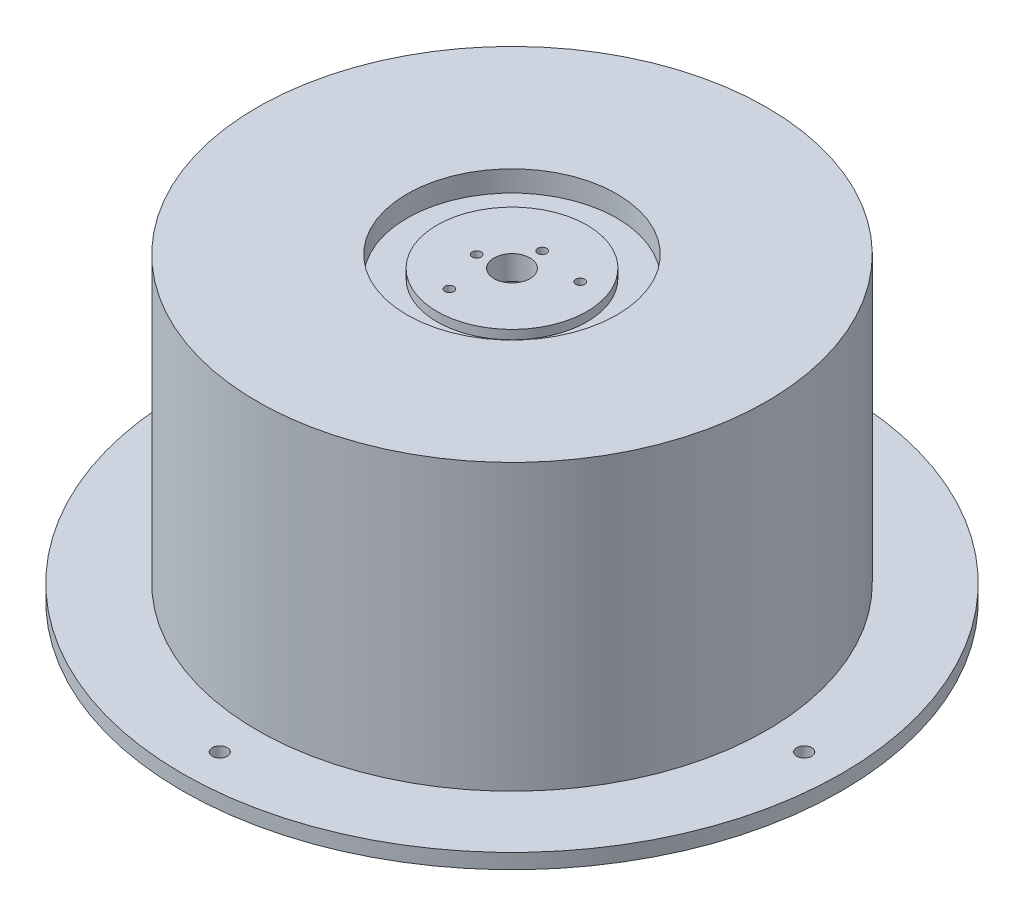
ISO-10303-21;
HEADER;
FILE_DESCRIPTION(('STEP AP214'),'2;1');
FILE_NAME('part.step','',(''),(''),'','','');
FILE_SCHEMA(('AUTOMOTIVE_DESIGN { 1 0 10303 214 1 1 1 1 }'));
ENDSEC;
DATA;
#1=APPLICATION_CONTEXT('core data for automotive mechanical design processes');
#2=APPLICATION_PROTOCOL_DEFINITION('international standard','automotive_design',2000,#1);
#3=PRODUCT_CONTEXT('',#1,'mechanical');
#4=PRODUCT('Part','Part','',(#3));
#5=PRODUCT_RELATED_PRODUCT_CATEGORY('part','',(#4));
#6=PRODUCT_DEFINITION_FORMATION('','',#4);
#7=PRODUCT_DEFINITION_CONTEXT('part definition',#1,'design');
#8=PRODUCT_DEFINITION('design','',#6,#7);
#9=PRODUCT_DEFINITION_SHAPE('','',#8);
#10=(LENGTH_UNIT() NAMED_UNIT(*) SI_UNIT(.MILLI.,.METRE.));
#11=(NAMED_UNIT(*) PLANE_ANGLE_UNIT() SI_UNIT($,.RADIAN.));
#12=(NAMED_UNIT(*) SI_UNIT($,.STERADIAN.) SOLID_ANGLE_UNIT());
#13=UNCERTAINTY_MEASURE_WITH_UNIT(LENGTH_MEASURE(1.E-05),#10,'distance_accuracy_value','');
#14=(GEOMETRIC_REPRESENTATION_CONTEXT(3) GLOBAL_UNCERTAINTY_ASSIGNED_CONTEXT((#13)) GLOBAL_UNIT_ASSIGNED_CONTEXT((#10,
#11,#12)) REPRESENTATION_CONTEXT('',''));
#15=CARTESIAN_POINT('',(0.,0.,0.));
#16=DIRECTION('',(0.,0.,1.));
#17=DIRECTION('',(1.,0.,0.));
#18=AXIS2_PLACEMENT_3D('',#15,#16,#17);
#19=CARTESIAN_POINT('',(0.,0.,0.));
#20=DIRECTION('',(0.,-1.,0.));
#21=DIRECTION('',(0.,0.,-1.));
#22=AXIS2_PLACEMENT_3D('',#19,#20,#21);
#23=CYLINDRICAL_SURFACE('',#22,85.);
#24=CARTESIAN_POINT('',(0.,100.,0.));
#25=DIRECTION('',(0.,-1.,0.));
#26=DIRECTION('',(0.,0.,-1.));
#27=AXIS2_PLACEMENT_3D('',#24,#25,#26);
#28=CIRCLE('',#27,85.);
#29=CARTESIAN_POINT('',(0.,100.,-85.));
#30=VERTEX_POINT('',#29);
#31=EDGE_CURVE('E67',#30,#30,#28,.T.);
#32=ORIENTED_EDGE('',*,*,#31,.T.);
#33=EDGE_LOOP('',(#32));
#34=FACE_BOUND('',#33,.T.);
#35=CARTESIAN_POINT('',(0.,5.,0.));
#36=DIRECTION('',(0.,-1.,0.));
#37=DIRECTION('',(0.,0.,-1.));
#38=AXIS2_PLACEMENT_3D('',#35,#36,#37);
#39=CIRCLE('',#38,85.);
#40=CARTESIAN_POINT('',(0.,5.,-85.));
#41=VERTEX_POINT('',#40);
#42=EDGE_CURVE('E98',#41,#41,#39,.T.);
#43=ORIENTED_EDGE('',*,*,#42,.F.);
#44=EDGE_LOOP('',(#43));
#45=FACE_BOUND('',#44,.T.);
#46=ADVANCED_FACE('F35',(#34,#45),#23,.T.);
#47=CARTESIAN_POINT('',(85.,0.,0.));
#48=DIRECTION('',(0.,-1.,0.));
#49=DIRECTION('',(0.,0.,-1.));
#50=AXIS2_PLACEMENT_3D('',#47,#48,#49);
#51=PLANE('',#50);
#52=CARTESIAN_POINT('',(0.,0.,0.));
#53=DIRECTION('',(0.,-1.,0.));
#54=DIRECTION('',(0.,0.,-1.));
#55=AXIS2_PLACEMENT_3D('',#52,#53,#54);
#56=CIRCLE('',#55,80.);
#57=CARTESIAN_POINT('',(0.,0.,-80.));
#58=VERTEX_POINT('',#57);
#59=EDGE_CURVE('E10',#58,#58,#56,.T.);
#60=ORIENTED_EDGE('',*,*,#59,.F.);
#61=EDGE_LOOP('',(#60));
#62=FACE_BOUND('',#61,.T.);
#63=CARTESIAN_POINT('',(-97.5,0.,0.));
#64=DIRECTION('',(0.,-1.,0.));
#65=DIRECTION('',(0.,0.,-1.));
#66=AXIS2_PLACEMENT_3D('',#63,#64,#65);
#67=CIRCLE('',#66,2.50000000000001);
#68=CARTESIAN_POINT('',(-97.5,0.,-2.50000000000002));
#69=VERTEX_POINT('',#68);
#70=EDGE_CURVE('E122',#69,#69,#67,.T.);
#71=ORIENTED_EDGE('',*,*,#70,.F.);
#72=EDGE_LOOP('',(#71));
#73=FACE_BOUND('',#72,.T.);
#74=CARTESIAN_POINT('',(0.,0.,-97.5));
#75=DIRECTION('',(0.,-1.,0.));
#76=DIRECTION('',(0.,0.,-1.));
#77=AXIS2_PLACEMENT_3D('',#74,#75,#76);
#78=CIRCLE('',#77,2.5);
#79=CARTESIAN_POINT('',(0.,0.,-100.));
#80=VERTEX_POINT('',#79);
#81=EDGE_CURVE('E116',#80,#80,#78,.T.);
#82=ORIENTED_EDGE('',*,*,#81,.F.);
#83=EDGE_LOOP('',(#82));
#84=FACE_BOUND('',#83,.T.);
#85=CARTESIAN_POINT('',(97.5,0.,0.));
#86=DIRECTION('',(0.,-1.,0.));
#87=DIRECTION('',(0.,0.,-1.));
#88=AXIS2_PLACEMENT_3D('',#85,#86,#87);
#89=CIRCLE('',#88,2.50000000000037);
#90=CARTESIAN_POINT('',(97.5,0.,-2.50000000000037));
#91=VERTEX_POINT('',#90);
#92=EDGE_CURVE('E110',#91,#91,#89,.T.);
#93=ORIENTED_EDGE('',*,*,#92,.F.);
#94=EDGE_LOOP('',(#93));
#95=FACE_BOUND('',#94,.T.);
#96=CARTESIAN_POINT('',(0.,0.,97.5));
#97=DIRECTION('',(0.,-1.,0.));
#98=DIRECTION('',(0.,0.,-1.));
#99=AXIS2_PLACEMENT_3D('',#96,#97,#98);
#100=CIRCLE('',#99,2.5);
#101=CARTESIAN_POINT('',(0.,0.,95.));
#102=VERTEX_POINT('',#101);
#103=EDGE_CURVE('E104',#102,#102,#100,.T.);
#104=ORIENTED_EDGE('',*,*,#103,.F.);
#105=EDGE_LOOP('',(#104));
#106=FACE_BOUND('',#105,.T.);
#107=CARTESIAN_POINT('',(0.,0.,0.));
#108=DIRECTION('',(0.,-1.,0.));
#109=DIRECTION('',(0.,0.,-1.));
#110=AXIS2_PLACEMENT_3D('',#107,#108,#109);
#111=CIRCLE('',#110,110.);
#112=CARTESIAN_POINT('',(0.,0.,-110.));
#113=VERTEX_POINT('',#112);
#114=EDGE_CURVE('E95',#113,#113,#111,.T.);
#115=ORIENTED_EDGE('',*,*,#114,.T.);
#116=EDGE_LOOP('',(#115));
#117=FACE_BOUND('',#116,.T.);
#118=ADVANCED_FACE('F37',(#62,#73,#84,#95,#106,#117),#51,.T.);
#119=CARTESIAN_POINT('',(0.,0.,0.));
#120=DIRECTION('',(0.,-1.,0.));
#121=DIRECTION('',(0.,0.,-1.));
#122=AXIS2_PLACEMENT_3D('',#119,#120,#121);
#123=CYLINDRICAL_SURFACE('',#122,80.);
#124=ORIENTED_EDGE('',*,*,#59,.T.);
#125=EDGE_LOOP('',(#124));
#126=FACE_BOUND('',#125,.T.);
#127=CARTESIAN_POINT('',(0.,88.,0.));
#128=DIRECTION('',(0.,-1.,0.));
#129=DIRECTION('',(0.,0.,-1.));
#130=AXIS2_PLACEMENT_3D('',#127,#128,#129);
#131=CIRCLE('',#130,80.);
#132=CARTESIAN_POINT('',(0.,88.,-80.));
#133=VERTEX_POINT('',#132);
#134=EDGE_CURVE('E42',#133,#133,#131,.T.);
#135=ORIENTED_EDGE('',*,*,#134,.F.);
#136=EDGE_LOOP('',(#135));
#137=FACE_BOUND('',#136,.T.);
#138=ADVANCED_FACE('F140',(#126,#137),#123,.F.);
#139=CARTESIAN_POINT('',(6.,88.,0.));
#140=DIRECTION('',(0.,-1.,0.));
#141=DIRECTION('',(0.,0.,-1.));
#142=AXIS2_PLACEMENT_3D('',#139,#140,#141);
#143=PLANE('',#142);
#144=CARTESIAN_POINT('',(15.2685446913402,88.,-7.49143130573526));
#145=DIRECTION('',(0.,-1.,0.));
#146=DIRECTION('',(0.,0.,-1.));
#147=AXIS2_PLACEMENT_3D('',#144,#145,#146);
#148=CIRCLE('',#147,1.5);
#149=CARTESIAN_POINT('',(15.2685446913402,88.,-8.99143130573526));
#150=VERTEX_POINT('',#149);
#151=EDGE_CURVE('E90',#150,#150,#148,.F.);
#152=ORIENTED_EDGE('',*,*,#151,.T.);
#153=EDGE_LOOP('',(#152));
#154=FACE_BOUND('',#153,.T.);
#155=CARTESIAN_POINT('',(0.,88.,-10.0525272360539));
#156=DIRECTION('',(0.,-1.,0.));
#157=DIRECTION('',(0.,0.,-1.));
#158=AXIS2_PLACEMENT_3D('',#155,#156,#157);
#159=CIRCLE('',#158,1.5);
#160=CARTESIAN_POINT('',(0.,88.,-11.5525272360539));
#161=VERTEX_POINT('',#160);
#162=EDGE_CURVE('E87',#161,#161,#159,.F.);
#163=ORIENTED_EDGE('',*,*,#162,.T.);
#164=EDGE_LOOP('',(#163));
#165=FACE_BOUND('',#164,.T.);
#166=CARTESIAN_POINT('',(-9.88805983877857,88.,1.88381527849953));
#167=DIRECTION('',(0.,-1.,0.));
#168=DIRECTION('',(0.,0.,-1.));
#169=AXIS2_PLACEMENT_3D('',#166,#167,#168);
#170=CIRCLE('',#169,1.5);
#171=CARTESIAN_POINT('',(-9.88805983877857,88.,0.383815278499537));
#172=VERTEX_POINT('',#171);
#173=EDGE_CURVE('E81',#172,#172,#170,.F.);
#174=ORIENTED_EDGE('',*,*,#173,.T.);
#175=EDGE_LOOP('',(#174));
#176=FACE_BOUND('',#175,.T.);
#177=CARTESIAN_POINT('',(-4.47525869965136,88.,16.4079876758607));
#178=DIRECTION('',(0.,-1.,0.));
#179=DIRECTION('',(0.,0.,-1.));
#180=AXIS2_PLACEMENT_3D('',#177,#178,#179);
#181=CIRCLE('',#180,1.5);
#182=CARTESIAN_POINT('',(-4.47525869965136,88.,14.9079876758607));
#183=VERTEX_POINT('',#182);
#184=EDGE_CURVE('E74',#183,#183,#181,.F.);
#185=ORIENTED_EDGE('',*,*,#184,.T.);
#186=EDGE_LOOP('',(#185));
#187=FACE_BOUND('',#186,.T.);
#188=ORIENTED_EDGE('',*,*,#134,.T.);
#189=EDGE_LOOP('',(#188));
#190=FACE_BOUND('',#189,.T.);
#191=CARTESIAN_POINT('',(0.,88.,0.));
#192=DIRECTION('',(0.,-1.,0.));
#193=DIRECTION('',(0.,0.,-1.));
#194=AXIS2_PLACEMENT_3D('',#191,#192,#193);
#195=CIRCLE('',#194,6.);
#196=CARTESIAN_POINT('',(0.,88.,-6.));
#197=VERTEX_POINT('',#196);
#198=EDGE_CURVE('E46',#197,#197,#195,.T.);
#199=ORIENTED_EDGE('',*,*,#198,.F.);
#200=EDGE_LOOP('',(#199));
#201=FACE_BOUND('',#200,.T.);
#202=ADVANCED_FACE('F197',(#154,#165,#176,#187,#190,#201),#143,.T.);
#203=CARTESIAN_POINT('',(0.,0.,0.));
#204=DIRECTION('',(0.,-1.,0.));
#205=DIRECTION('',(0.,0.,-1.));
#206=AXIS2_PLACEMENT_3D('',#203,#204,#205);
#207=CYLINDRICAL_SURFACE('',#206,6.);
#208=ORIENTED_EDGE('',*,*,#198,.T.);
#209=EDGE_LOOP('',(#208));
#210=FACE_BOUND('',#209,.T.);
#211=CARTESIAN_POINT('',(0.,96.,0.));
#212=DIRECTION('',(0.,-1.,0.));
#213=DIRECTION('',(0.,0.,-1.));
#214=AXIS2_PLACEMENT_3D('',#211,#212,#213);
#215=CIRCLE('',#214,6.);
#216=CARTESIAN_POINT('',(0.,96.,-6.));
#217=VERTEX_POINT('',#216);
#218=EDGE_CURVE('E50',#217,#217,#215,.T.);
#219=ORIENTED_EDGE('',*,*,#218,.F.);
#220=EDGE_LOOP('',(#219));
#221=FACE_BOUND('',#220,.T.);
#222=ADVANCED_FACE('F193',(#210,#221),#207,.F.);
#223=CARTESIAN_POINT('',(25.,96.,0.));
#224=DIRECTION('',(0.,1.,0.));
#225=DIRECTION('',(0.,0.,1.));
#226=AXIS2_PLACEMENT_3D('',#223,#224,#225);
#227=PLANE('',#226);
#228=CARTESIAN_POINT('',(15.2685446913402,96.,-7.49143130573526));
#229=DIRECTION('',(0.,1.,0.));
#230=DIRECTION('',(0.,0.,1.));
#231=AXIS2_PLACEMENT_3D('',#228,#229,#230);
#232=CIRCLE('',#231,1.5);
#233=CARTESIAN_POINT('',(15.2685446913402,96.,-5.99143130573526));
#234=VERTEX_POINT('',#233);
#235=EDGE_CURVE('E70',#234,#234,#232,.T.);
#236=ORIENTED_EDGE('',*,*,#235,.F.);
#237=EDGE_LOOP('',(#236));
#238=FACE_BOUND('',#237,.T.);
#239=CARTESIAN_POINT('',(0.,96.,-10.0525272360539));
#240=DIRECTION('',(0.,1.,0.));
#241=DIRECTION('',(0.,0.,1.));
#242=AXIS2_PLACEMENT_3D('',#239,#240,#241);
#243=CIRCLE('',#242,1.5);
#244=CARTESIAN_POINT('',(0.,96.,-8.55252723605387));
#245=VERTEX_POINT('',#244);
#246=EDGE_CURVE('E84',#245,#245,#243,.T.);
#247=ORIENTED_EDGE('',*,*,#246,.F.);
#248=EDGE_LOOP('',(#247));
#249=FACE_BOUND('',#248,.T.);
#250=CARTESIAN_POINT('',(-9.88805983877857,96.,1.88381527849953));
#251=DIRECTION('',(0.,1.,0.));
#252=DIRECTION('',(0.,0.,1.));
#253=AXIS2_PLACEMENT_3D('',#250,#251,#252);
#254=CIRCLE('',#253,1.5);
#255=CARTESIAN_POINT('',(-9.88805983877857,96.,3.38381527849953));
#256=VERTEX_POINT('',#255);
#257=EDGE_CURVE('E78',#256,#256,#254,.T.);
#258=ORIENTED_EDGE('',*,*,#257,.F.);
#259=EDGE_LOOP('',(#258));
#260=FACE_BOUND('',#259,.T.);
#261=CARTESIAN_POINT('',(-4.47525869965136,96.,16.4079876758607));
#262=DIRECTION('',(0.,1.,0.));
#263=DIRECTION('',(0.,0.,1.));
#264=AXIS2_PLACEMENT_3D('',#261,#262,#263);
#265=CIRCLE('',#264,1.5);
#266=CARTESIAN_POINT('',(-4.47525869965136,96.,17.9079876758607));
#267=VERTEX_POINT('',#266);
#268=EDGE_CURVE('E71',#267,#267,#265,.T.);
#269=ORIENTED_EDGE('',*,*,#268,.F.);
#270=EDGE_LOOP('',(#269));
#271=FACE_BOUND('',#270,.T.);
#272=ORIENTED_EDGE('',*,*,#218,.T.);
#273=EDGE_LOOP('',(#272));
#274=FACE_BOUND('',#273,.T.);
#275=CARTESIAN_POINT('',(0.,96.,0.));
#276=DIRECTION('',(0.,-1.,0.));
#277=DIRECTION('',(0.,0.,-1.));
#278=AXIS2_PLACEMENT_3D('',#275,#276,#277);
#279=CIRCLE('',#278,25.);
#280=CARTESIAN_POINT('',(0.,96.,-25.));
#281=VERTEX_POINT('',#280);
#282=EDGE_CURVE('E55',#281,#281,#279,.T.);
#283=ORIENTED_EDGE('',*,*,#282,.F.);
#284=EDGE_LOOP('',(#283));
#285=FACE_BOUND('',#284,.T.);
#286=ADVANCED_FACE('F189',(#238,#249,#260,#271,#274,#285),#227,.T.);
#287=CARTESIAN_POINT('',(0.,0.,0.));
#288=DIRECTION('',(0.,-1.,0.));
#289=DIRECTION('',(0.,0.,-1.));
#290=AXIS2_PLACEMENT_3D('',#287,#288,#289);
#291=CYLINDRICAL_SURFACE('',#290,25.);
#292=ORIENTED_EDGE('',*,*,#282,.T.);
#293=EDGE_LOOP('',(#292));
#294=FACE_BOUND('',#293,.T.);
#295=CARTESIAN_POINT('',(0.,93.,0.));
#296=DIRECTION('',(0.,-1.,0.));
#297=DIRECTION('',(0.,0.,-1.));
#298=AXIS2_PLACEMENT_3D('',#295,#296,#297);
#299=CIRCLE('',#298,25.);
#300=CARTESIAN_POINT('',(0.,93.,-25.));
#301=VERTEX_POINT('',#300);
#302=EDGE_CURVE('E58',#301,#301,#299,.T.);
#303=ORIENTED_EDGE('',*,*,#302,.F.);
#304=EDGE_LOOP('',(#303));
#305=FACE_BOUND('',#304,.T.);
#306=ADVANCED_FACE('F185',(#294,#305),#291,.T.);
#307=CARTESIAN_POINT('',(35.,93.,0.));
#308=DIRECTION('',(0.,1.,0.));
#309=DIRECTION('',(0.,0.,1.));
#310=AXIS2_PLACEMENT_3D('',#307,#308,#309);
#311=PLANE('',#310);
#312=ORIENTED_EDGE('',*,*,#302,.T.);
#313=EDGE_LOOP('',(#312));
#314=FACE_BOUND('',#313,.T.);
#315=CARTESIAN_POINT('',(0.,93.,0.));
#316=DIRECTION('',(0.,-1.,0.));
#317=DIRECTION('',(0.,0.,-1.));
#318=AXIS2_PLACEMENT_3D('',#315,#316,#317);
#319=CIRCLE('',#318,35.);
#320=CARTESIAN_POINT('',(0.,93.,-35.));
#321=VERTEX_POINT('',#320);
#322=EDGE_CURVE('E61',#321,#321,#319,.T.);
#323=ORIENTED_EDGE('',*,*,#322,.F.);
#324=EDGE_LOOP('',(#323));
#325=FACE_BOUND('',#324,.T.);
#326=ADVANCED_FACE('F181',(#314,#325),#311,.T.);
#327=CARTESIAN_POINT('',(0.,0.,0.));
#328=DIRECTION('',(0.,-1.,0.));
#329=DIRECTION('',(0.,0.,-1.));
#330=AXIS2_PLACEMENT_3D('',#327,#328,#329);
#331=CYLINDRICAL_SURFACE('',#330,35.);
#332=ORIENTED_EDGE('',*,*,#322,.T.);
#333=EDGE_LOOP('',(#332));
#334=FACE_BOUND('',#333,.T.);
#335=CARTESIAN_POINT('',(0.,100.,0.));
#336=DIRECTION('',(0.,-1.,0.));
#337=DIRECTION('',(0.,0.,-1.));
#338=AXIS2_PLACEMENT_3D('',#335,#336,#337);
#339=CIRCLE('',#338,35.);
#340=CARTESIAN_POINT('',(0.,100.,-35.));
#341=VERTEX_POINT('',#340);
#342=EDGE_CURVE('E64',#341,#341,#339,.T.);
#343=ORIENTED_EDGE('',*,*,#342,.F.);
#344=EDGE_LOOP('',(#343));
#345=FACE_BOUND('',#344,.T.);
#346=ADVANCED_FACE('F177',(#334,#345),#331,.F.);
#347=CARTESIAN_POINT('',(35.,100.,0.));
#348=DIRECTION('',(0.,1.,0.));
#349=DIRECTION('',(0.,0.,1.));
#350=AXIS2_PLACEMENT_3D('',#347,#348,#349);
#351=PLANE('',#350);
#352=ORIENTED_EDGE('',*,*,#342,.T.);
#353=EDGE_LOOP('',(#352));
#354=FACE_BOUND('',#353,.T.);
#355=ORIENTED_EDGE('',*,*,#31,.F.);
#356=EDGE_LOOP('',(#355));
#357=FACE_BOUND('',#356,.T.);
#358=ADVANCED_FACE('F174',(#354,#357),#351,.T.);
#359=CARTESIAN_POINT('',(-4.47525869965136,-0.001000000000001,16.4079876758607));
#360=DIRECTION('',(0.,1.,0.));
#361=DIRECTION('',(0.,0.,1.));
#362=AXIS2_PLACEMENT_3D('',#359,#360,#361);
#363=CYLINDRICAL_SURFACE('',#362,1.5);
#364=ORIENTED_EDGE('',*,*,#184,.F.);
#365=EDGE_LOOP('',(#364));
#366=FACE_BOUND('',#365,.T.);
#367=ORIENTED_EDGE('',*,*,#268,.T.);
#368=EDGE_LOOP('',(#367));
#369=FACE_BOUND('',#368,.T.);
#370=ADVANCED_FACE('F172',(#366,#369),#363,.F.);
#371=CARTESIAN_POINT('',(-9.88805983877857,-0.001000000000001,1.88381527849953));
#372=DIRECTION('',(0.,1.,0.));
#373=DIRECTION('',(0.,0.,1.));
#374=AXIS2_PLACEMENT_3D('',#371,#372,#373);
#375=CYLINDRICAL_SURFACE('',#374,1.5);
#376=ORIENTED_EDGE('',*,*,#173,.F.);
#377=EDGE_LOOP('',(#376));
#378=FACE_BOUND('',#377,.T.);
#379=ORIENTED_EDGE('',*,*,#257,.T.);
#380=EDGE_LOOP('',(#379));
#381=FACE_BOUND('',#380,.T.);
#382=ADVANCED_FACE('F241',(#378,#381),#375,.F.);
#383=CARTESIAN_POINT('',(0.,-0.001000000000001,-10.0525272360539));
#384=DIRECTION('',(0.,1.,0.));
#385=DIRECTION('',(0.,0.,1.));
#386=AXIS2_PLACEMENT_3D('',#383,#384,#385);
#387=CYLINDRICAL_SURFACE('',#386,1.5);
#388=ORIENTED_EDGE('',*,*,#162,.F.);
#389=EDGE_LOOP('',(#388));
#390=FACE_BOUND('',#389,.T.);
#391=ORIENTED_EDGE('',*,*,#246,.T.);
#392=EDGE_LOOP('',(#391));
#393=FACE_BOUND('',#392,.T.);
#394=ADVANCED_FACE('F161',(#390,#393),#387,.F.);
#395=CARTESIAN_POINT('',(15.2685446913402,-0.001000000000001,-7.49143130573526));
#396=DIRECTION('',(0.,1.,0.));
#397=DIRECTION('',(0.,0.,1.));
#398=AXIS2_PLACEMENT_3D('',#395,#396,#397);
#399=CYLINDRICAL_SURFACE('',#398,1.5);
#400=ORIENTED_EDGE('',*,*,#151,.F.);
#401=EDGE_LOOP('',(#400));
#402=FACE_BOUND('',#401,.T.);
#403=ORIENTED_EDGE('',*,*,#235,.T.);
#404=EDGE_LOOP('',(#403));
#405=FACE_BOUND('',#404,.T.);
#406=ADVANCED_FACE('F152',(#402,#405),#399,.F.);
#407=CARTESIAN_POINT('',(0.,5.,0.));
#408=DIRECTION('',(0.,-1.,0.));
#409=DIRECTION('',(0.,0.,-1.));
#410=AXIS2_PLACEMENT_3D('',#407,#408,#409);
#411=CYLINDRICAL_SURFACE('',#410,110.);
#412=CARTESIAN_POINT('',(0.,5.,0.));
#413=DIRECTION('',(0.,-1.,0.));
#414=DIRECTION('',(0.,0.,-1.));
#415=AXIS2_PLACEMENT_3D('',#412,#413,#414);
#416=CIRCLE('',#415,110.);
#417=CARTESIAN_POINT('',(0.,5.,-110.));
#418=VERTEX_POINT('',#417);
#419=EDGE_CURVE('E75',#418,#418,#416,.T.);
#420=ORIENTED_EDGE('',*,*,#419,.T.);
#421=EDGE_LOOP('',(#420));
#422=FACE_BOUND('',#421,.T.);
#423=ORIENTED_EDGE('',*,*,#114,.F.);
#424=EDGE_LOOP('',(#423));
#425=FACE_BOUND('',#424,.T.);
#426=ADVANCED_FACE('F150',(#422,#425),#411,.T.);
#427=CARTESIAN_POINT('',(0.,5.,0.));
#428=DIRECTION('',(0.,-1.,0.));
#429=DIRECTION('',(0.,0.,-1.));
#430=AXIS2_PLACEMENT_3D('',#427,#428,#429);
#431=PLANE('',#430);
#432=CARTESIAN_POINT('',(-97.5,5.,0.));
#433=DIRECTION('',(0.,-1.,0.));
#434=DIRECTION('',(0.,0.,-1.));
#435=AXIS2_PLACEMENT_3D('',#432,#433,#434);
#436=CIRCLE('',#435,2.50000000000001);
#437=CARTESIAN_POINT('',(-97.5,5.,-2.50000000000002));
#438=VERTEX_POINT('',#437);
#439=EDGE_CURVE('E119',#438,#438,#436,.T.);
#440=ORIENTED_EDGE('',*,*,#439,.T.);
#441=EDGE_LOOP('',(#440));
#442=FACE_BOUND('',#441,.T.);
#443=CARTESIAN_POINT('',(0.,5.,-97.5));
#444=DIRECTION('',(0.,-1.,0.));
#445=DIRECTION('',(0.,0.,-1.));
#446=AXIS2_PLACEMENT_3D('',#443,#444,#445);
#447=CIRCLE('',#446,2.5);
#448=CARTESIAN_POINT('',(0.,5.,-100.));
#449=VERTEX_POINT('',#448);
#450=EDGE_CURVE('E113',#449,#449,#447,.T.);
#451=ORIENTED_EDGE('',*,*,#450,.T.);
#452=EDGE_LOOP('',(#451));
#453=FACE_BOUND('',#452,.T.);
#454=CARTESIAN_POINT('',(97.5,5.,0.));
#455=DIRECTION('',(0.,-1.,0.));
#456=DIRECTION('',(0.,0.,-1.));
#457=AXIS2_PLACEMENT_3D('',#454,#455,#456);
#458=CIRCLE('',#457,2.50000000000037);
#459=CARTESIAN_POINT('',(97.5,5.,-2.50000000000037));
#460=VERTEX_POINT('',#459);
#461=EDGE_CURVE('E107',#460,#460,#458,.T.);
#462=ORIENTED_EDGE('',*,*,#461,.T.);
#463=EDGE_LOOP('',(#462));
#464=FACE_BOUND('',#463,.T.);
#465=CARTESIAN_POINT('',(0.,5.,97.5));
#466=DIRECTION('',(0.,-1.,0.));
#467=DIRECTION('',(0.,0.,-1.));
#468=AXIS2_PLACEMENT_3D('',#465,#466,#467);
#469=CIRCLE('',#468,2.5);
#470=CARTESIAN_POINT('',(0.,5.,95.));
#471=VERTEX_POINT('',#470);
#472=EDGE_CURVE('E103',#471,#471,#469,.T.);
#473=ORIENTED_EDGE('',*,*,#472,.T.);
#474=EDGE_LOOP('',(#473));
#475=FACE_BOUND('',#474,.T.);
#476=ORIENTED_EDGE('',*,*,#42,.T.);
#477=EDGE_LOOP('',(#476));
#478=FACE_BOUND('',#477,.T.);
#479=ORIENTED_EDGE('',*,*,#419,.F.);
#480=EDGE_LOOP('',(#479));
#481=FACE_BOUND('',#480,.T.);
#482=ADVANCED_FACE('F128',(#442,#453,#464,#475,#478,#481),#431,.F.);
#483=CARTESIAN_POINT('',(0.,5.,97.5));
#484=DIRECTION('',(0.,-1.,0.));
#485=DIRECTION('',(0.,0.,-1.));
#486=AXIS2_PLACEMENT_3D('',#483,#484,#485);
#487=CYLINDRICAL_SURFACE('',#486,2.5);
#488=ORIENTED_EDGE('',*,*,#472,.F.);
#489=EDGE_LOOP('',(#488));
#490=FACE_BOUND('',#489,.T.);
#491=ORIENTED_EDGE('',*,*,#103,.T.);
#492=EDGE_LOOP('',(#491));
#493=FACE_BOUND('',#492,.T.);
#494=ADVANCED_FACE('F159',(#490,#493),#487,.F.);
#495=CARTESIAN_POINT('',(97.5,5.,0.));
#496=DIRECTION('',(0.,-1.,0.));
#497=DIRECTION('',(0.,0.,-1.));
#498=AXIS2_PLACEMENT_3D('',#495,#496,#497);
#499=CYLINDRICAL_SURFACE('',#498,2.50000000000037);
#500=ORIENTED_EDGE('',*,*,#461,.F.);
#501=EDGE_LOOP('',(#500));
#502=FACE_BOUND('',#501,.T.);
#503=ORIENTED_EDGE('',*,*,#92,.T.);
#504=EDGE_LOOP('',(#503));
#505=FACE_BOUND('',#504,.T.);
#506=ADVANCED_FACE('F290',(#502,#505),#499,.F.);
#507=CARTESIAN_POINT('',(0.,5.,-97.5));
#508=DIRECTION('',(0.,-1.,0.));
#509=DIRECTION('',(0.,0.,-1.));
#510=AXIS2_PLACEMENT_3D('',#507,#508,#509);
#511=CYLINDRICAL_SURFACE('',#510,2.5);
#512=ORIENTED_EDGE('',*,*,#450,.F.);
#513=EDGE_LOOP('',(#512));
#514=FACE_BOUND('',#513,.T.);
#515=ORIENTED_EDGE('',*,*,#81,.T.);
#516=EDGE_LOOP('',(#515));
#517=FACE_BOUND('',#516,.T.);
#518=ADVANCED_FACE('F134',(#514,#517),#511,.F.);
#519=CARTESIAN_POINT('',(-97.5,5.,0.));
#520=DIRECTION('',(0.,-1.,0.));
#521=DIRECTION('',(0.,0.,-1.));
#522=AXIS2_PLACEMENT_3D('',#519,#520,#521);
#523=CYLINDRICAL_SURFACE('',#522,2.50000000000001);
#524=ORIENTED_EDGE('',*,*,#439,.F.);
#525=EDGE_LOOP('',(#524));
#526=FACE_BOUND('',#525,.T.);
#527=ORIENTED_EDGE('',*,*,#70,.T.);
#528=EDGE_LOOP('',(#527));
#529=FACE_BOUND('',#528,.T.);
#530=ADVANCED_FACE('F131',(#526,#529),#523,.F.);
#531=CLOSED_SHELL('',(#46,#118,#138,#202,#222,#286,#306,#326,#346,#358,#370,#382,#394,#406,#426,
#482,#494,#506,#518,#530));
#532=MANIFOLD_SOLID_BREP('B2',#531);
#533=ADVANCED_BREP_SHAPE_REPRESENTATION('',(#18,#532),#14);
#534=SHAPE_DEFINITION_REPRESENTATION(#9,#533);
ENDSEC;
END-ISO-10303-21;
